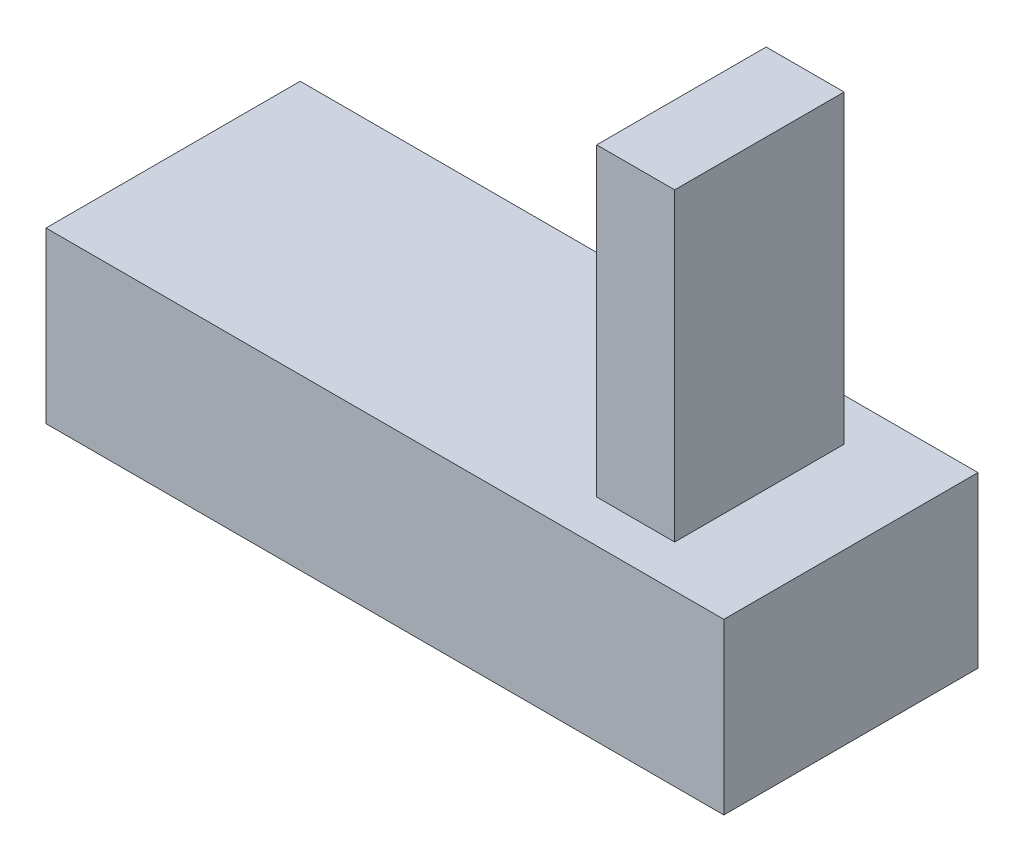
ISO-10303-21;
HEADER;
FILE_DESCRIPTION(('STEP AP214'),'2;1');
FILE_NAME('part.step','',(''),(''),'','','');
FILE_SCHEMA(('AUTOMOTIVE_DESIGN { 1 0 10303 214 1 1 1 1 }'));
ENDSEC;
DATA;
#1=APPLICATION_CONTEXT('core data for automotive mechanical design processes');
#2=APPLICATION_PROTOCOL_DEFINITION('international standard','automotive_design',2000,#1);
#3=PRODUCT_CONTEXT('',#1,'mechanical');
#4=PRODUCT('Part','Part','',(#3));
#5=PRODUCT_RELATED_PRODUCT_CATEGORY('part','',(#4));
#6=PRODUCT_DEFINITION_FORMATION('','',#4);
#7=PRODUCT_DEFINITION_CONTEXT('part definition',#1,'design');
#8=PRODUCT_DEFINITION('design','',#6,#7);
#9=PRODUCT_DEFINITION_SHAPE('','',#8);
#10=(LENGTH_UNIT() NAMED_UNIT(*) SI_UNIT(.MILLI.,.METRE.));
#11=(NAMED_UNIT(*) PLANE_ANGLE_UNIT() SI_UNIT($,.RADIAN.));
#12=(NAMED_UNIT(*) SI_UNIT($,.STERADIAN.) SOLID_ANGLE_UNIT());
#13=UNCERTAINTY_MEASURE_WITH_UNIT(LENGTH_MEASURE(1.E-05),#10,'distance_accuracy_value','');
#14=(GEOMETRIC_REPRESENTATION_CONTEXT(3) GLOBAL_UNCERTAINTY_ASSIGNED_CONTEXT((#13)) GLOBAL_UNIT_ASSIGNED_CONTEXT((#10,
#11,#12)) REPRESENTATION_CONTEXT('',''));
#15=CARTESIAN_POINT('',(0.,0.,0.));
#16=DIRECTION('',(0.,0.,1.));
#17=DIRECTION('',(1.,0.,0.));
#18=AXIS2_PLACEMENT_3D('',#15,#16,#17);
#19=CARTESIAN_POINT('',(0.,10.,0.));
#20=DIRECTION('',(0.,-1.,0.));
#21=DIRECTION('',(0.,0.,-1.));
#22=AXIS2_PLACEMENT_3D('',#19,#20,#21);
#23=PLANE('',#22);
#24=DIRECTION('',(0.,0.,-1.));
#25=VECTOR('',#24,1.);
#26=CARTESIAN_POINT('',(-20.,10.,7.5));
#27=LINE('',#26,#25);
#28=CARTESIAN_POINT('',(-20.,10.,7.5));
#29=VERTEX_POINT('',#28);
#30=CARTESIAN_POINT('',(-20.,10.,-7.5));
#31=VERTEX_POINT('',#30);
#32=EDGE_CURVE('E131',#29,#31,#27,.T.);
#33=ORIENTED_EDGE('',*,*,#32,.F.);
#34=DIRECTION('',(1.,0.,0.));
#35=VECTOR('',#34,1.);
#36=CARTESIAN_POINT('',(-20.,10.,7.5));
#37=LINE('',#36,#35);
#38=CARTESIAN_POINT('',(20.,10.,7.5));
#39=VERTEX_POINT('',#38);
#40=EDGE_CURVE('E140',#29,#39,#37,.T.);
#41=ORIENTED_EDGE('',*,*,#40,.T.);
#42=DIRECTION('',(0.,0.,-1.));
#43=VECTOR('',#42,1.);
#44=CARTESIAN_POINT('',(20.,10.,7.5));
#45=LINE('',#44,#43);
#46=CARTESIAN_POINT('',(20.,10.,-7.5));
#47=VERTEX_POINT('',#46);
#48=EDGE_CURVE('E138',#39,#47,#45,.T.);
#49=ORIENTED_EDGE('',*,*,#48,.T.);
#50=DIRECTION('',(1.,0.,0.));
#51=VECTOR('',#50,1.);
#52=CARTESIAN_POINT('',(-20.,10.,-7.5));
#53=LINE('',#52,#51);
#54=EDGE_CURVE('E134',#31,#47,#53,.T.);
#55=ORIENTED_EDGE('',*,*,#54,.F.);
#56=EDGE_LOOP('',(#33,#41,#49,#55));
#57=FACE_BOUND('',#56,.T.);
#58=DIRECTION('',(0.,0.,-1.));
#59=VECTOR('',#58,1.);
#60=CARTESIAN_POINT('',(14.6,10.,5.));
#61=LINE('',#60,#59);
#62=CARTESIAN_POINT('',(14.6,10.,5.));
#63=VERTEX_POINT('',#62);
#64=CARTESIAN_POINT('',(14.6,10.,-5.));
#65=VERTEX_POINT('',#64);
#66=EDGE_CURVE('E121',#63,#65,#61,.T.);
#67=ORIENTED_EDGE('',*,*,#66,.F.);
#68=DIRECTION('',(1.,0.,0.));
#69=VECTOR('',#68,1.);
#70=CARTESIAN_POINT('',(10.,10.,5.));
#71=LINE('',#70,#69);
#72=CARTESIAN_POINT('',(10.,10.,5.));
#73=VERTEX_POINT('',#72);
#74=EDGE_CURVE('E118',#73,#63,#71,.T.);
#75=ORIENTED_EDGE('',*,*,#74,.F.);
#76=DIRECTION('',(0.,0.,1.));
#77=VECTOR('',#76,1.);
#78=CARTESIAN_POINT('',(10.,10.,5.));
#79=LINE('',#78,#77);
#80=CARTESIAN_POINT('',(10.,10.,-5.));
#81=VERTEX_POINT('',#80);
#82=EDGE_CURVE('E57',#81,#73,#79,.T.);
#83=ORIENTED_EDGE('',*,*,#82,.F.);
#84=DIRECTION('',(-1.,0.,0.));
#85=VECTOR('',#84,1.);
#86=CARTESIAN_POINT('',(10.,10.,-5.));
#87=LINE('',#86,#85);
#88=EDGE_CURVE('E52',#65,#81,#87,.T.);
#89=ORIENTED_EDGE('',*,*,#88,.F.);
#90=EDGE_LOOP('',(#67,#75,#83,#89));
#91=FACE_BOUND('',#90,.T.);
#92=ADVANCED_FACE('F35',(#57,#91),#23,.F.);
#93=CARTESIAN_POINT('',(-20.,10.,7.5));
#94=DIRECTION('',(-1.,0.,0.));
#95=DIRECTION('',(0.,0.,1.));
#96=AXIS2_PLACEMENT_3D('',#93,#94,#95);
#97=PLANE('',#96);
#98=DIRECTION('',(0.,0.,-1.));
#99=VECTOR('',#98,1.);
#100=CARTESIAN_POINT('',(-20.,0.,7.5));
#101=LINE('',#100,#99);
#102=CARTESIAN_POINT('',(-20.,0.,7.5));
#103=VERTEX_POINT('',#102);
#104=CARTESIAN_POINT('',(-20.,0.,-7.5));
#105=VERTEX_POINT('',#104);
#106=EDGE_CURVE('E122',#103,#105,#101,.T.);
#107=ORIENTED_EDGE('',*,*,#106,.F.);
#108=DIRECTION('',(0.,-1.,0.));
#109=VECTOR('',#108,1.);
#110=CARTESIAN_POINT('',(-20.,10.,7.5));
#111=LINE('',#110,#109);
#112=EDGE_CURVE('E11',#29,#103,#111,.T.);
#113=ORIENTED_EDGE('',*,*,#112,.F.);
#114=ORIENTED_EDGE('',*,*,#32,.T.);
#115=DIRECTION('',(0.,-1.,0.));
#116=VECTOR('',#115,1.);
#117=CARTESIAN_POINT('',(-20.,10.,-7.5));
#118=LINE('',#117,#116);
#119=EDGE_CURVE('E39',#31,#105,#118,.T.);
#120=ORIENTED_EDGE('',*,*,#119,.T.);
#121=EDGE_LOOP('',(#107,#113,#114,#120));
#122=FACE_BOUND('',#121,.T.);
#123=ADVANCED_FACE('F37',(#122),#97,.T.);
#124=CARTESIAN_POINT('',(-20.,10.,7.5));
#125=DIRECTION('',(0.,0.,-1.));
#126=DIRECTION('',(-1.,0.,0.));
#127=AXIS2_PLACEMENT_3D('',#124,#125,#126);
#128=PLANE('',#127);
#129=DIRECTION('',(1.,0.,0.));
#130=VECTOR('',#129,1.);
#131=CARTESIAN_POINT('',(-20.,0.,7.5));
#132=LINE('',#131,#130);
#133=CARTESIAN_POINT('',(20.,0.,7.5));
#134=VERTEX_POINT('',#133);
#135=EDGE_CURVE('E135',#103,#134,#132,.T.);
#136=ORIENTED_EDGE('',*,*,#135,.T.);
#137=DIRECTION('',(0.,-1.,0.));
#138=VECTOR('',#137,1.);
#139=CARTESIAN_POINT('',(20.,10.,7.5));
#140=LINE('',#139,#138);
#141=EDGE_CURVE('E44',#39,#134,#140,.T.);
#142=ORIENTED_EDGE('',*,*,#141,.F.);
#143=ORIENTED_EDGE('',*,*,#40,.F.);
#144=ORIENTED_EDGE('',*,*,#112,.T.);
#145=EDGE_LOOP('',(#136,#142,#143,#144));
#146=FACE_BOUND('',#145,.T.);
#147=ADVANCED_FACE('F164',(#146),#128,.F.);
#148=CARTESIAN_POINT('',(20.,10.,7.5));
#149=DIRECTION('',(-1.,0.,0.));
#150=DIRECTION('',(0.,0.,1.));
#151=AXIS2_PLACEMENT_3D('',#148,#149,#150);
#152=PLANE('',#151);
#153=DIRECTION('',(0.,0.,-1.));
#154=VECTOR('',#153,1.);
#155=CARTESIAN_POINT('',(20.,0.,7.5));
#156=LINE('',#155,#154);
#157=CARTESIAN_POINT('',(20.,0.,-7.5));
#158=VERTEX_POINT('',#157);
#159=EDGE_CURVE('E144',#134,#158,#156,.T.);
#160=ORIENTED_EDGE('',*,*,#159,.T.);
#161=DIRECTION('',(0.,-1.,0.));
#162=VECTOR('',#161,1.);
#163=CARTESIAN_POINT('',(20.,10.,-7.5));
#164=LINE('',#163,#162);
#165=EDGE_CURVE('E149',#47,#158,#164,.T.);
#166=ORIENTED_EDGE('',*,*,#165,.F.);
#167=ORIENTED_EDGE('',*,*,#48,.F.);
#168=ORIENTED_EDGE('',*,*,#141,.T.);
#169=EDGE_LOOP('',(#160,#166,#167,#168));
#170=FACE_BOUND('',#169,.T.);
#171=ADVANCED_FACE('F168',(#170),#152,.F.);
#172=CARTESIAN_POINT('',(-20.,10.,-7.5));
#173=DIRECTION('',(0.,0.,-1.));
#174=DIRECTION('',(-1.,0.,0.));
#175=AXIS2_PLACEMENT_3D('',#172,#173,#174);
#176=PLANE('',#175);
#177=DIRECTION('',(1.,0.,0.));
#178=VECTOR('',#177,1.);
#179=CARTESIAN_POINT('',(-20.,0.,-7.5));
#180=LINE('',#179,#178);
#181=EDGE_CURVE('E125',#105,#158,#180,.T.);
#182=ORIENTED_EDGE('',*,*,#181,.F.);
#183=ORIENTED_EDGE('',*,*,#119,.F.);
#184=ORIENTED_EDGE('',*,*,#54,.T.);
#185=ORIENTED_EDGE('',*,*,#165,.T.);
#186=EDGE_LOOP('',(#182,#183,#184,#185));
#187=FACE_BOUND('',#186,.T.);
#188=ADVANCED_FACE('F157',(#187),#176,.T.);
#189=CARTESIAN_POINT('',(0.,0.,0.));
#190=DIRECTION('',(0.,-1.,0.));
#191=DIRECTION('',(0.,0.,-1.));
#192=AXIS2_PLACEMENT_3D('',#189,#190,#191);
#193=PLANE('',#192);
#194=ORIENTED_EDGE('',*,*,#106,.T.);
#195=ORIENTED_EDGE('',*,*,#181,.T.);
#196=ORIENTED_EDGE('',*,*,#159,.F.);
#197=ORIENTED_EDGE('',*,*,#135,.F.);
#198=EDGE_LOOP('',(#194,#195,#196,#197));
#199=FACE_BOUND('',#198,.T.);
#200=ADVANCED_FACE('F161',(#199),#193,.T.);
#201=CARTESIAN_POINT('',(14.6,28.,5.));
#202=DIRECTION('',(-1.,0.,0.));
#203=DIRECTION('',(0.,0.,1.));
#204=AXIS2_PLACEMENT_3D('',#201,#202,#203);
#205=PLANE('',#204);
#206=ORIENTED_EDGE('',*,*,#66,.T.);
#207=DIRECTION('',(0.,-1.,0.));
#208=VECTOR('',#207,1.);
#209=CARTESIAN_POINT('',(14.6,28.,-5.));
#210=LINE('',#209,#208);
#211=CARTESIAN_POINT('',(14.6,28.,-5.));
#212=VERTEX_POINT('',#211);
#213=EDGE_CURVE('E102',#212,#65,#210,.T.);
#214=ORIENTED_EDGE('',*,*,#213,.F.);
#215=DIRECTION('',(0.,0.,-1.));
#216=VECTOR('',#215,1.);
#217=CARTESIAN_POINT('',(14.6,28.,5.));
#218=LINE('',#217,#216);
#219=CARTESIAN_POINT('',(14.6,28.,5.));
#220=VERTEX_POINT('',#219);
#221=EDGE_CURVE('E109',#220,#212,#218,.T.);
#222=ORIENTED_EDGE('',*,*,#221,.F.);
#223=DIRECTION('',(0.,-1.,0.));
#224=VECTOR('',#223,1.);
#225=CARTESIAN_POINT('',(14.6,28.,5.));
#226=LINE('',#225,#224);
#227=EDGE_CURVE('E177',#220,#63,#226,.T.);
#228=ORIENTED_EDGE('',*,*,#227,.T.);
#229=EDGE_LOOP('',(#206,#214,#222,#228));
#230=FACE_BOUND('',#229,.T.);
#231=ADVANCED_FACE('F120',(#230),#205,.F.);
#232=CARTESIAN_POINT('',(10.,28.,-5.));
#233=DIRECTION('',(0.,0.,1.));
#234=DIRECTION('',(1.,0.,0.));
#235=AXIS2_PLACEMENT_3D('',#232,#233,#234);
#236=PLANE('',#235);
#237=ORIENTED_EDGE('',*,*,#88,.T.);
#238=DIRECTION('',(0.,-1.,0.));
#239=VECTOR('',#238,1.);
#240=CARTESIAN_POINT('',(10.,28.,-5.));
#241=LINE('',#240,#239);
#242=CARTESIAN_POINT('',(10.,28.,-5.));
#243=VERTEX_POINT('',#242);
#244=EDGE_CURVE('E105',#243,#81,#241,.T.);
#245=ORIENTED_EDGE('',*,*,#244,.F.);
#246=DIRECTION('',(-1.,0.,0.));
#247=VECTOR('',#246,1.);
#248=CARTESIAN_POINT('',(10.,28.,-5.));
#249=LINE('',#248,#247);
#250=EDGE_CURVE('E98',#212,#243,#249,.T.);
#251=ORIENTED_EDGE('',*,*,#250,.F.);
#252=ORIENTED_EDGE('',*,*,#213,.T.);
#253=EDGE_LOOP('',(#237,#245,#251,#252));
#254=FACE_BOUND('',#253,.T.);
#255=ADVANCED_FACE('F100',(#254),#236,.F.);
#256=CARTESIAN_POINT('',(10.,28.,5.));
#257=DIRECTION('',(1.,0.,0.));
#258=DIRECTION('',(0.,0.,-1.));
#259=AXIS2_PLACEMENT_3D('',#256,#257,#258);
#260=PLANE('',#259);
#261=ORIENTED_EDGE('',*,*,#82,.T.);
#262=DIRECTION('',(0.,-1.,0.));
#263=VECTOR('',#262,1.);
#264=CARTESIAN_POINT('',(10.,28.,5.));
#265=LINE('',#264,#263);
#266=CARTESIAN_POINT('',(10.,28.,5.));
#267=VERTEX_POINT('',#266);
#268=EDGE_CURVE('E127',#267,#73,#265,.T.);
#269=ORIENTED_EDGE('',*,*,#268,.F.);
#270=DIRECTION('',(0.,0.,1.));
#271=VECTOR('',#270,1.);
#272=CARTESIAN_POINT('',(10.,28.,5.));
#273=LINE('',#272,#271);
#274=EDGE_CURVE('E108',#243,#267,#273,.T.);
#275=ORIENTED_EDGE('',*,*,#274,.F.);
#276=ORIENTED_EDGE('',*,*,#244,.T.);
#277=EDGE_LOOP('',(#261,#269,#275,#276));
#278=FACE_BOUND('',#277,.T.);
#279=ADVANCED_FACE('F186',(#278),#260,.F.);
#280=CARTESIAN_POINT('',(10.,28.,5.));
#281=DIRECTION('',(0.,0.,-1.));
#282=DIRECTION('',(-1.,0.,0.));
#283=AXIS2_PLACEMENT_3D('',#280,#281,#282);
#284=PLANE('',#283);
#285=ORIENTED_EDGE('',*,*,#74,.T.);
#286=ORIENTED_EDGE('',*,*,#227,.F.);
#287=DIRECTION('',(1.,0.,0.));
#288=VECTOR('',#287,1.);
#289=CARTESIAN_POINT('',(10.,28.,5.));
#290=LINE('',#289,#288);
#291=EDGE_CURVE('E114',#267,#220,#290,.T.);
#292=ORIENTED_EDGE('',*,*,#291,.F.);
#293=ORIENTED_EDGE('',*,*,#268,.T.);
#294=EDGE_LOOP('',(#285,#286,#292,#293));
#295=FACE_BOUND('',#294,.T.);
#296=ADVANCED_FACE('F176',(#295),#284,.F.);
#297=CARTESIAN_POINT('',(0.,28.,0.));
#298=DIRECTION('',(0.,-1.,0.));
#299=DIRECTION('',(0.,0.,-1.));
#300=AXIS2_PLACEMENT_3D('',#297,#298,#299);
#301=PLANE('',#300);
#302=ORIENTED_EDGE('',*,*,#221,.T.);
#303=ORIENTED_EDGE('',*,*,#250,.T.);
#304=ORIENTED_EDGE('',*,*,#274,.T.);
#305=ORIENTED_EDGE('',*,*,#291,.T.);
#306=EDGE_LOOP('',(#302,#303,#304,#305));
#307=FACE_BOUND('',#306,.T.);
#308=ADVANCED_FACE('F112',(#307),#301,.F.);
#309=CLOSED_SHELL('',(#92,#123,#147,#171,#188,#200,#231,#255,#279,#296,#308));
#310=MANIFOLD_SOLID_BREP('B2',#309);
#311=ADVANCED_BREP_SHAPE_REPRESENTATION('',(#18,#310),#14);
#312=SHAPE_DEFINITION_REPRESENTATION(#9,#311);
ENDSEC;
END-ISO-10303-21;
